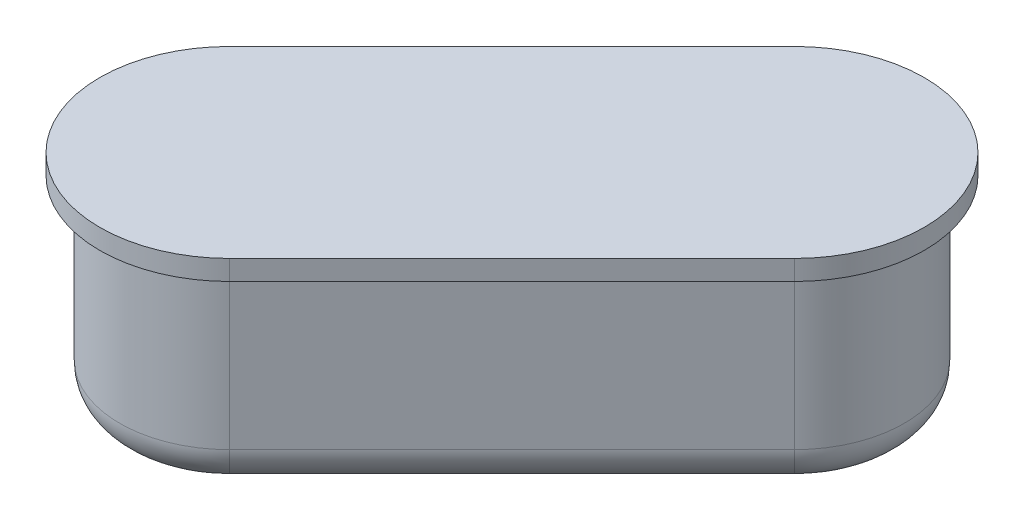
ISO-10303-21;
HEADER;
FILE_DESCRIPTION(('STEP AP214'),'2;1');
FILE_NAME('part.step','',(''),(''),'','','');
FILE_SCHEMA(('AUTOMOTIVE_DESIGN { 1 0 10303 214 1 1 1 1 }'));
ENDSEC;
DATA;
#1=APPLICATION_CONTEXT('core data for automotive mechanical design processes');
#2=APPLICATION_PROTOCOL_DEFINITION('international standard','automotive_design',2000,#1);
#3=PRODUCT_CONTEXT('',#1,'mechanical');
#4=PRODUCT('Part','Part','',(#3));
#5=PRODUCT_RELATED_PRODUCT_CATEGORY('part','',(#4));
#6=PRODUCT_DEFINITION_FORMATION('','',#4);
#7=PRODUCT_DEFINITION_CONTEXT('part definition',#1,'design');
#8=PRODUCT_DEFINITION('design','',#6,#7);
#9=PRODUCT_DEFINITION_SHAPE('','',#8);
#10=(LENGTH_UNIT() NAMED_UNIT(*) SI_UNIT(.MILLI.,.METRE.));
#11=(NAMED_UNIT(*) PLANE_ANGLE_UNIT() SI_UNIT($,.RADIAN.));
#12=(NAMED_UNIT(*) SI_UNIT($,.STERADIAN.) SOLID_ANGLE_UNIT());
#13=UNCERTAINTY_MEASURE_WITH_UNIT(LENGTH_MEASURE(1.E-05),#10,'distance_accuracy_value','');
#14=(GEOMETRIC_REPRESENTATION_CONTEXT(3) GLOBAL_UNCERTAINTY_ASSIGNED_CONTEXT((#13)) GLOBAL_UNIT_ASSIGNED_CONTEXT((#10,
#11,#12)) REPRESENTATION_CONTEXT('',''));
#15=CARTESIAN_POINT('',(0.,0.,0.));
#16=DIRECTION('',(0.,0.,1.));
#17=DIRECTION('',(1.,0.,0.));
#18=AXIS2_PLACEMENT_3D('',#15,#16,#17);
#19=CARTESIAN_POINT('',(21.85,-1.1,8.95));
#20=DIRECTION('',(0.,-1.,0.));
#21=DIRECTION('',(0.,0.,-1.));
#22=AXIS2_PLACEMENT_3D('',#19,#20,#21);
#23=PLANE('',#22);
#24=CARTESIAN_POINT('',(21.85,-1.1,5.42861556591387));
#25=DIRECTION('',(0.,1.,0.));
#26=DIRECTION('',(-0.707106781186538,0.,-0.707106781186557));
#27=AXIS2_PLACEMENT_3D('',#24,#25,#26);
#28=CIRCLE('',#27,0.350000000000007);
#29=CARTESIAN_POINT('',(22.0974873734153,-1.1,5.67610293932917));
#30=VERTEX_POINT('',#29);
#31=CARTESIAN_POINT('',(21.6025126265847,-1.1,5.18112819249857));
#32=VERTEX_POINT('',#31);
#33=EDGE_CURVE('E280',#30,#32,#28,.F.);
#34=ORIENTED_EDGE('',*,*,#33,.T.);
#35=DIRECTION('',(0.707106781186547,0.,-0.707106781186548));
#36=VECTOR('',#35,1.);
#37=CARTESIAN_POINT('',(20.5277121532369,-1.1,6.2559286658464));
#38=LINE('',#37,#36);
#39=CARTESIAN_POINT('',(23.0167261889578,-1.1,3.76691463012548));
#40=VERTEX_POINT('',#39);
#41=EDGE_CURVE('E247',#40,#32,#38,.F.);
#42=ORIENTED_EDGE('',*,*,#41,.F.);
#43=CARTESIAN_POINT('',(23.2642135623731,-1.1,4.01440200354077));
#44=DIRECTION('',(0.,1.,0.));
#45=DIRECTION('',(0.707106781186544,0.,0.707106781186551));
#46=AXIS2_PLACEMENT_3D('',#43,#44,#45);
#47=CIRCLE('',#46,0.350000000000004);
#48=CARTESIAN_POINT('',(23.5117009357884,-1.1,4.26188937695606));
#49=VERTEX_POINT('',#48);
#50=EDGE_CURVE('E248',#49,#40,#47,.T.);
#51=ORIENTED_EDGE('',*,*,#50,.F.);
#52=DIRECTION('',(-0.707106781186547,0.,0.707106781186548));
#53=VECTOR('',#52,1.);
#54=CARTESIAN_POINT('',(22.1187024109066,-1.1,5.65488790183786));
#55=LINE('',#54,#53);
#56=EDGE_CURVE('E293',#30,#49,#55,.F.);
#57=ORIENTED_EDGE('',*,*,#56,.F.);
#58=EDGE_LOOP('',(#34,#42,#51,#57));
#59=FACE_BOUND('',#58,.T.);
#60=ADVANCED_FACE('F16',(#59),#23,.T.);
#61=CARTESIAN_POINT('',(22.1187024109066,-0.900000000000002,5.65488790183785));
#62=DIRECTION('',(-0.707106781186547,0.,0.707106781186548));
#63=DIRECTION('',(0.707106781186548,0.,0.707106781186547));
#64=AXIS2_PLACEMENT_3D('',#61,#62,#63);
#65=CYLINDRICAL_SURFACE('',#64,0.199999999999999);
#66=CARTESIAN_POINT('',(23.5117009357884,-0.900000000000002,4.26188937695606));
#67=DIRECTION('',(0.707106781186548,0.,-0.707106781186547));
#68=DIRECTION('',(0.707106781186547,0.,0.707106781186548));
#69=AXIS2_PLACEMENT_3D('',#66,#67,#68);
#70=CIRCLE('',#69,0.199999999999999);
#71=CARTESIAN_POINT('',(23.6531222920257,-0.900000000000002,4.40331073319337));
#72=VERTEX_POINT('',#71);
#73=EDGE_CURVE('E235',#72,#49,#70,.T.);
#74=ORIENTED_EDGE('',*,*,#73,.F.);
#75=DIRECTION('',(0.707106781186547,0.,-0.707106781186548));
#76=VECTOR('',#75,1.);
#77=CARTESIAN_POINT('',(24.0420310216783,-0.900000000000002,4.01440200354077));
#78=LINE('',#77,#76);
#79=CARTESIAN_POINT('',(22.2389087296526,-0.900000000000002,5.81752429556647));
#80=VERTEX_POINT('',#79);
#81=EDGE_CURVE('E128',#80,#72,#78,.T.);
#82=ORIENTED_EDGE('',*,*,#81,.F.);
#83=CARTESIAN_POINT('',(22.0974873734153,-0.900000000000002,5.67610293932916));
#84=DIRECTION('',(0.707106781186552,0.,-0.707106781186543));
#85=DIRECTION('',(0.707106781186543,0.,0.707106781186552));
#86=AXIS2_PLACEMENT_3D('',#83,#84,#85);
#87=CIRCLE('',#86,0.199999999999999);
#88=EDGE_CURVE('E298',#30,#80,#87,.F.);
#89=ORIENTED_EDGE('',*,*,#88,.F.);
#90=ORIENTED_EDGE('',*,*,#56,.T.);
#91=EDGE_LOOP('',(#74,#82,#89,#90));
#92=FACE_BOUND('',#91,.T.);
#93=ADVANCED_FACE('F256',(#92),#65,.T.);
#94=CARTESIAN_POINT('',(23.2642135623731,-0.900000000000002,4.01440200354077));
#95=DIRECTION('',(0.,1.,0.));
#96=DIRECTION('',(0.,0.,1.));
#97=AXIS2_PLACEMENT_3D('',#94,#95,#96);
#98=TOROIDAL_SURFACE('',#97,0.349999999999999,0.199999999999999);
#99=CARTESIAN_POINT('',(23.0167261889578,-0.900000000000002,3.76691463012549));
#100=DIRECTION('',(0.707106781186547,0.,-0.707106781186548));
#101=DIRECTION('',(-0.707106781186548,0.,-0.707106781186547));
#102=AXIS2_PLACEMENT_3D('',#99,#100,#101);
#103=CIRCLE('',#102,0.199999999999999);
#104=CARTESIAN_POINT('',(22.8753048327205,-0.900000000000002,3.62549327388817));
#105=VERTEX_POINT('',#104);
#106=EDGE_CURVE('E238',#105,#40,#103,.F.);
#107=ORIENTED_EDGE('',*,*,#106,.F.);
#108=CARTESIAN_POINT('',(23.2642135623731,-0.900000000000002,4.01440200354077));
#109=DIRECTION('',(0.,-1.,0.));
#110=DIRECTION('',(0.,0.,-1.));
#111=AXIS2_PLACEMENT_3D('',#108,#109,#110);
#112=CIRCLE('',#111,0.549999999999998);
#113=EDGE_CURVE('E88',#72,#105,#112,.F.);
#114=ORIENTED_EDGE('',*,*,#113,.F.);
#115=ORIENTED_EDGE('',*,*,#73,.T.);
#116=ORIENTED_EDGE('',*,*,#50,.T.);
#117=EDGE_LOOP('',(#107,#114,#115,#116));
#118=FACE_BOUND('',#117,.T.);
#119=ADVANCED_FACE('F232',(#118),#98,.T.);
#120=CARTESIAN_POINT('',(20.5277121532369,-0.900000000000002,6.25592866584641));
#121=DIRECTION('',(0.707106781186547,0.,-0.707106781186548));
#122=DIRECTION('',(-0.707106781186548,0.,-0.707106781186547));
#123=AXIS2_PLACEMENT_3D('',#120,#121,#122);
#124=CYLINDRICAL_SURFACE('',#123,0.199999999999999);
#125=ORIENTED_EDGE('',*,*,#106,.T.);
#126=ORIENTED_EDGE('',*,*,#41,.T.);
#127=CARTESIAN_POINT('',(21.6025126265847,-0.900000000000002,5.18112819249858));
#128=DIRECTION('',(-0.707106781186549,0.,0.707106781186546));
#129=DIRECTION('',(-0.707106781186546,0.,-0.707106781186549));
#130=AXIS2_PLACEMENT_3D('',#127,#128,#129);
#131=CIRCLE('',#130,0.199999999999999);
#132=CARTESIAN_POINT('',(21.4610912703474,-0.900000000000002,5.03970683626127));
#133=VERTEX_POINT('',#132);
#134=EDGE_CURVE('E131',#133,#32,#131,.T.);
#135=ORIENTED_EDGE('',*,*,#134,.F.);
#136=DIRECTION('',(-0.707106781186547,0.,0.707106781186548));
#137=VECTOR('',#136,1.);
#138=CARTESIAN_POINT('',(21.0721825406948,-0.900000000000002,5.42861556591387));
#139=LINE('',#138,#137);
#140=EDGE_CURVE('E94',#105,#133,#139,.T.);
#141=ORIENTED_EDGE('',*,*,#140,.F.);
#142=EDGE_LOOP('',(#125,#126,#135,#141));
#143=FACE_BOUND('',#142,.T.);
#144=ADVANCED_FACE('F144',(#143),#124,.T.);
#145=CARTESIAN_POINT('',(21.85,-0.900000000000002,5.42861556591387));
#146=DIRECTION('',(0.,1.,0.));
#147=DIRECTION('',(0.,0.,1.));
#148=AXIS2_PLACEMENT_3D('',#145,#146,#147);
#149=TOROIDAL_SURFACE('',#148,0.349999999999999,0.199999999999999);
#150=ORIENTED_EDGE('',*,*,#134,.T.);
#151=ORIENTED_EDGE('',*,*,#33,.F.);
#152=ORIENTED_EDGE('',*,*,#88,.T.);
#153=CARTESIAN_POINT('',(21.85,-0.900000000000002,5.42861556591387));
#154=DIRECTION('',(0.,-1.,0.));
#155=DIRECTION('',(0.,0.,-1.));
#156=AXIS2_PLACEMENT_3D('',#153,#154,#155);
#157=CIRCLE('',#156,0.549999999999998);
#158=EDGE_CURVE('E93',#133,#80,#157,.F.);
#159=ORIENTED_EDGE('',*,*,#158,.F.);
#160=EDGE_LOOP('',(#150,#151,#152,#159));
#161=FACE_BOUND('',#160,.T.);
#162=ADVANCED_FACE('F138',(#161),#149,.T.);
#163=CARTESIAN_POINT('',(24.0420310216783,0.,4.01440200354077));
#164=DIRECTION('',(0.707106781186548,0.,0.707106781186547));
#165=DIRECTION('',(0.707106781186547,0.,-0.707106781186548));
#166=AXIS2_PLACEMENT_3D('',#163,#164,#165);
#167=PLANE('',#166);
#168=DIRECTION('',(0.707106781186548,0.,-0.707106781186547));
#169=VECTOR('',#168,1.);
#170=CARTESIAN_POINT('',(22.2389087296526,-0.1,5.81752429556647));
#171=LINE('',#170,#169);
#172=CARTESIAN_POINT('',(22.2389087296526,-0.1,5.81752429556647));
#173=VERTEX_POINT('',#172);
#174=CARTESIAN_POINT('',(23.6531222920257,-0.1,4.40331073319337));
#175=VERTEX_POINT('',#174);
#176=EDGE_CURVE('E71',#173,#175,#171,.T.);
#177=ORIENTED_EDGE('',*,*,#176,.F.);
#178=DIRECTION('',(0.,-1.,0.));
#179=VECTOR('',#178,1.);
#180=CARTESIAN_POINT('',(22.2389087296526,0.,5.81752429556647));
#181=LINE('',#180,#179);
#182=EDGE_CURVE('E108',#80,#173,#181,.F.);
#183=ORIENTED_EDGE('',*,*,#182,.F.);
#184=ORIENTED_EDGE('',*,*,#81,.T.);
#185=DIRECTION('',(0.,-1.,0.));
#186=VECTOR('',#185,1.);
#187=CARTESIAN_POINT('',(23.6531222920257,0.,4.40331073319337));
#188=LINE('',#187,#186);
#189=EDGE_CURVE('E117',#175,#72,#188,.T.);
#190=ORIENTED_EDGE('',*,*,#189,.F.);
#191=EDGE_LOOP('',(#177,#183,#184,#190));
#192=FACE_BOUND('',#191,.T.);
#193=ADVANCED_FACE('F143',(#192),#167,.T.);
#194=CARTESIAN_POINT('',(23.2642135623731,0.,4.01440200354077));
#195=DIRECTION('',(0.,-1.,0.));
#196=DIRECTION('',(0.,0.,-1.));
#197=AXIS2_PLACEMENT_3D('',#194,#195,#196);
#198=CYLINDRICAL_SURFACE('',#197,0.549999999999998);
#199=CARTESIAN_POINT('',(23.2642135623731,-0.1,4.01440200354077));
#200=DIRECTION('',(0.,-1.,0.));
#201=DIRECTION('',(0.,0.,-1.));
#202=AXIS2_PLACEMENT_3D('',#199,#200,#201);
#203=CIRCLE('',#202,0.549999999999998);
#204=CARTESIAN_POINT('',(22.8753048327205,-0.1,3.62549327388817));
#205=VERTEX_POINT('',#204);
#206=EDGE_CURVE('E20',#175,#205,#203,.F.);
#207=ORIENTED_EDGE('',*,*,#206,.F.);
#208=ORIENTED_EDGE('',*,*,#189,.T.);
#209=ORIENTED_EDGE('',*,*,#113,.T.);
#210=DIRECTION('',(0.,1.,0.));
#211=VECTOR('',#210,1.);
#212=CARTESIAN_POINT('',(22.8753048327205,0.,3.62549327388817));
#213=LINE('',#212,#211);
#214=EDGE_CURVE('E84',#205,#105,#213,.F.);
#215=ORIENTED_EDGE('',*,*,#214,.F.);
#216=EDGE_LOOP('',(#207,#208,#209,#215));
#217=FACE_BOUND('',#216,.T.);
#218=ADVANCED_FACE('F85',(#217),#198,.T.);
#219=CARTESIAN_POINT('',(21.0721825406948,0.,5.42861556591387));
#220=DIRECTION('',(-0.707106781186548,0.,-0.707106781186547));
#221=DIRECTION('',(-0.707106781186547,0.,0.707106781186548));
#222=AXIS2_PLACEMENT_3D('',#219,#220,#221);
#223=PLANE('',#222);
#224=DIRECTION('',(-0.707106781186548,0.,0.707106781186548));
#225=VECTOR('',#224,1.);
#226=CARTESIAN_POINT('',(22.8753048327205,-0.1,3.62549327388817));
#227=LINE('',#226,#225);
#228=CARTESIAN_POINT('',(21.4610912703474,-0.1,5.03970683626127));
#229=VERTEX_POINT('',#228);
#230=EDGE_CURVE('E78',#205,#229,#227,.T.);
#231=ORIENTED_EDGE('',*,*,#230,.F.);
#232=ORIENTED_EDGE('',*,*,#214,.T.);
#233=ORIENTED_EDGE('',*,*,#140,.T.);
#234=DIRECTION('',(0.,-1.,0.));
#235=VECTOR('',#234,1.);
#236=CARTESIAN_POINT('',(21.4610912703474,0.,5.03970683626127));
#237=LINE('',#236,#235);
#238=EDGE_CURVE('E98',#229,#133,#237,.T.);
#239=ORIENTED_EDGE('',*,*,#238,.F.);
#240=EDGE_LOOP('',(#231,#232,#233,#239));
#241=FACE_BOUND('',#240,.T.);
#242=ADVANCED_FACE('F96',(#241),#223,.T.);
#243=CARTESIAN_POINT('',(21.85,0.,5.42861556591387));
#244=DIRECTION('',(0.,-1.,0.));
#245=DIRECTION('',(0.,0.,-1.));
#246=AXIS2_PLACEMENT_3D('',#243,#244,#245);
#247=CYLINDRICAL_SURFACE('',#246,0.549999999999998);
#248=CARTESIAN_POINT('',(21.85,-0.1,5.42861556591387));
#249=DIRECTION('',(0.,-1.,0.));
#250=DIRECTION('',(0.,0.,-1.));
#251=AXIS2_PLACEMENT_3D('',#248,#249,#250);
#252=CIRCLE('',#251,0.549999999999998);
#253=EDGE_CURVE('E100',#229,#173,#252,.F.);
#254=ORIENTED_EDGE('',*,*,#253,.F.);
#255=ORIENTED_EDGE('',*,*,#238,.T.);
#256=ORIENTED_EDGE('',*,*,#158,.T.);
#257=ORIENTED_EDGE('',*,*,#182,.T.);
#258=EDGE_LOOP('',(#254,#255,#256,#257));
#259=FACE_BOUND('',#258,.T.);
#260=ADVANCED_FACE('F212',(#259),#247,.T.);
#261=CARTESIAN_POINT('',(21.85,-0.1,8.95));
#262=DIRECTION('',(0.,-1.,0.));
#263=DIRECTION('',(0.,0.,-1.));
#264=AXIS2_PLACEMENT_3D('',#261,#262,#263);
#265=PLANE('',#264);
#266=ORIENTED_EDGE('',*,*,#230,.T.);
#267=ORIENTED_EDGE('',*,*,#253,.T.);
#268=ORIENTED_EDGE('',*,*,#176,.T.);
#269=ORIENTED_EDGE('',*,*,#206,.T.);
#270=EDGE_LOOP('',(#266,#267,#268,#269));
#271=FACE_BOUND('',#270,.T.);
#272=CARTESIAN_POINT('',(21.85,-0.1,5.42861556591387));
#273=DIRECTION('',(0.,-1.,0.));
#274=DIRECTION('',(0.,0.,-1.));
#275=AXIS2_PLACEMENT_3D('',#272,#273,#274);
#276=CIRCLE('',#275,0.65);
#277=CARTESIAN_POINT('',(21.3903805922287,-0.1,4.96899615814263));
#278=VERTEX_POINT('',#277);
#279=CARTESIAN_POINT('',(22.3096194077713,-0.1,5.88823497368511));
#280=VERTEX_POINT('',#279);
#281=EDGE_CURVE('E167',#278,#280,#276,.F.);
#282=ORIENTED_EDGE('',*,*,#281,.F.);
#283=DIRECTION('',(-0.707106781186547,0.,0.707106781186548));
#284=VECTOR('',#283,1.);
#285=CARTESIAN_POINT('',(20.9307611844575,-0.1,5.42861556591387));
#286=LINE('',#285,#284);
#287=CARTESIAN_POINT('',(22.8045941546018,-0.1,3.55478259576953));
#288=VERTEX_POINT('',#287);
#289=EDGE_CURVE('E105',#288,#278,#286,.T.);
#290=ORIENTED_EDGE('',*,*,#289,.F.);
#291=CARTESIAN_POINT('',(23.2642135623731,-0.1,4.01440200354077));
#292=DIRECTION('',(0.,-1.,0.));
#293=DIRECTION('',(0.,0.,-1.));
#294=AXIS2_PLACEMENT_3D('',#291,#292,#293);
#295=CIRCLE('',#294,0.65);
#296=CARTESIAN_POINT('',(23.7238329701443,-0.1,4.47402141131204));
#297=VERTEX_POINT('',#296);
#298=EDGE_CURVE('E164',#297,#288,#295,.F.);
#299=ORIENTED_EDGE('',*,*,#298,.F.);
#300=DIRECTION('',(0.707106781186547,0.,-0.707106781186548));
#301=VECTOR('',#300,1.);
#302=CARTESIAN_POINT('',(24.1834523779156,-0.1,4.01440200354077));
#303=LINE('',#302,#301);
#304=EDGE_CURVE('E102',#280,#297,#303,.T.);
#305=ORIENTED_EDGE('',*,*,#304,.F.);
#306=EDGE_LOOP('',(#282,#290,#299,#305));
#307=FACE_BOUND('',#306,.T.);
#308=ADVANCED_FACE('F75',(#271,#307),#265,.T.);
#309=CARTESIAN_POINT('',(24.1834523779156,0.,4.01440200354077));
#310=DIRECTION('',(0.707106781186548,0.,0.707106781186547));
#311=DIRECTION('',(0.707106781186547,0.,-0.707106781186548));
#312=AXIS2_PLACEMENT_3D('',#309,#310,#311);
#313=PLANE('',#312);
#314=DIRECTION('',(0.,-1.,0.));
#315=VECTOR('',#314,1.);
#316=CARTESIAN_POINT('',(22.3096194077713,0.,5.8882349736851));
#317=LINE('',#316,#315);
#318=CARTESIAN_POINT('',(22.3096194077713,0.,5.88823497368512));
#319=VERTEX_POINT('',#318);
#320=EDGE_CURVE('E168',#280,#319,#317,.F.);
#321=ORIENTED_EDGE('',*,*,#320,.F.);
#322=ORIENTED_EDGE('',*,*,#304,.T.);
#323=DIRECTION('',(0.,-1.,0.));
#324=VECTOR('',#323,1.);
#325=CARTESIAN_POINT('',(23.7238329701443,0.,4.47402141131206));
#326=LINE('',#325,#324);
#327=CARTESIAN_POINT('',(23.7238329701443,0.,4.47402141131202));
#328=VERTEX_POINT('',#327);
#329=EDGE_CURVE('E180',#328,#297,#326,.T.);
#330=ORIENTED_EDGE('',*,*,#329,.F.);
#331=DIRECTION('',(-0.707106781186525,0.,0.70710678118657));
#332=VECTOR('',#331,1.);
#333=CARTESIAN_POINT('',(23.7238329701443,0.,4.47402141131203));
#334=LINE('',#333,#332);
#335=EDGE_CURVE('E163',#328,#319,#334,.T.);
#336=ORIENTED_EDGE('',*,*,#335,.T.);
#337=EDGE_LOOP('',(#321,#322,#330,#336));
#338=FACE_BOUND('',#337,.T.);
#339=ADVANCED_FACE('F193',(#338),#313,.T.);
#340=CARTESIAN_POINT('',(21.85,0.,5.42861556591387));
#341=DIRECTION('',(0.,-1.,0.));
#342=DIRECTION('',(0.,0.,-1.));
#343=AXIS2_PLACEMENT_3D('',#340,#341,#342);
#344=CYLINDRICAL_SURFACE('',#343,0.65);
#345=CARTESIAN_POINT('',(21.85,0.,5.42861556591387));
#346=DIRECTION('',(0.,-1.,0.));
#347=DIRECTION('',(0.,0.,-1.));
#348=AXIS2_PLACEMENT_3D('',#345,#346,#347);
#349=CIRCLE('',#348,0.65);
#350=CARTESIAN_POINT('',(21.3903805922287,0.,4.96899615814261));
#351=VERTEX_POINT('',#350);
#352=EDGE_CURVE('E160',#319,#351,#349,.T.);
#353=ORIENTED_EDGE('',*,*,#352,.T.);
#354=DIRECTION('',(0.,1.,0.));
#355=VECTOR('',#354,1.);
#356=CARTESIAN_POINT('',(21.3903805922287,0.,4.96899615814264));
#357=LINE('',#356,#355);
#358=EDGE_CURVE('E166',#278,#351,#357,.T.);
#359=ORIENTED_EDGE('',*,*,#358,.F.);
#360=ORIENTED_EDGE('',*,*,#281,.T.);
#361=ORIENTED_EDGE('',*,*,#320,.T.);
#362=EDGE_LOOP('',(#353,#359,#360,#361));
#363=FACE_BOUND('',#362,.T.);
#364=ADVANCED_FACE('F192',(#363),#344,.T.);
#365=CARTESIAN_POINT('',(20.9307611844575,0.,5.42861556591387));
#366=DIRECTION('',(-0.707106781186548,0.,-0.707106781186547));
#367=DIRECTION('',(-0.707106781186547,0.,0.707106781186548));
#368=AXIS2_PLACEMENT_3D('',#365,#366,#367);
#369=PLANE('',#368);
#370=ORIENTED_EDGE('',*,*,#358,.T.);
#371=DIRECTION('',(0.70710678118655,0.,-0.707106781186545));
#372=VECTOR('',#371,1.);
#373=CARTESIAN_POINT('',(21.3903805922287,0.,4.96899615814261));
#374=LINE('',#373,#372);
#375=CARTESIAN_POINT('',(22.8045941546018,0.,3.55478259576952));
#376=VERTEX_POINT('',#375);
#377=EDGE_CURVE('E26',#351,#376,#374,.T.);
#378=ORIENTED_EDGE('',*,*,#377,.T.);
#379=DIRECTION('',(0.,-1.,0.));
#380=VECTOR('',#379,1.);
#381=CARTESIAN_POINT('',(22.8045941546018,0.,3.55478259576954));
#382=LINE('',#381,#380);
#383=EDGE_CURVE('E34',#288,#376,#382,.F.);
#384=ORIENTED_EDGE('',*,*,#383,.F.);
#385=ORIENTED_EDGE('',*,*,#289,.T.);
#386=EDGE_LOOP('',(#370,#378,#384,#385));
#387=FACE_BOUND('',#386,.T.);
#388=ADVANCED_FACE('F188',(#387),#369,.T.);
#389=CARTESIAN_POINT('',(23.2642135623731,0.,4.01440200354077));
#390=DIRECTION('',(0.,-1.,0.));
#391=DIRECTION('',(0.,0.,-1.));
#392=AXIS2_PLACEMENT_3D('',#389,#390,#391);
#393=CYLINDRICAL_SURFACE('',#392,0.65);
#394=CARTESIAN_POINT('',(23.2642135623731,0.,4.01440200354077));
#395=DIRECTION('',(0.,-1.,0.));
#396=DIRECTION('',(0.,0.,-1.));
#397=AXIS2_PLACEMENT_3D('',#394,#395,#396);
#398=CIRCLE('',#397,0.65);
#399=EDGE_CURVE('E11',#376,#328,#398,.T.);
#400=ORIENTED_EDGE('',*,*,#399,.T.);
#401=ORIENTED_EDGE('',*,*,#329,.T.);
#402=ORIENTED_EDGE('',*,*,#298,.T.);
#403=ORIENTED_EDGE('',*,*,#383,.T.);
#404=EDGE_LOOP('',(#400,#401,#402,#403));
#405=FACE_BOUND('',#404,.T.);
#406=ADVANCED_FACE('F195',(#405),#393,.T.);
#407=CARTESIAN_POINT('',(21.85,0.,8.95));
#408=DIRECTION('',(0.,-1.,0.));
#409=DIRECTION('',(0.,0.,-1.));
#410=AXIS2_PLACEMENT_3D('',#407,#408,#409);
#411=PLANE('',#410);
#412=ORIENTED_EDGE('',*,*,#377,.F.);
#413=ORIENTED_EDGE('',*,*,#352,.F.);
#414=ORIENTED_EDGE('',*,*,#335,.F.);
#415=ORIENTED_EDGE('',*,*,#399,.F.);
#416=EDGE_LOOP('',(#412,#413,#414,#415));
#417=FACE_BOUND('',#416,.T.);
#418=ADVANCED_FACE('F191',(#417),#411,.F.);
#419=CLOSED_SHELL('',(#60,#93,#119,#144,#162,#193,#218,#242,#260,#308,#339,#364,#388,#406,#418));
#420=MANIFOLD_SOLID_BREP('B1',#419);
#421=ADVANCED_BREP_SHAPE_REPRESENTATION('',(#18,#420),#14);
#422=SHAPE_DEFINITION_REPRESENTATION(#9,#421);
ENDSEC;
END-ISO-10303-21;
